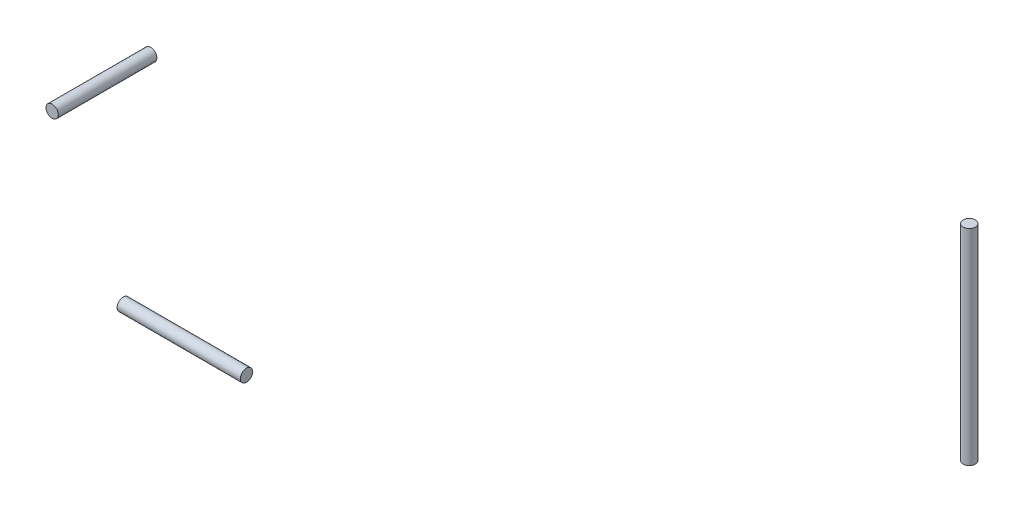
ISO-10303-21;
HEADER;
FILE_DESCRIPTION(('STEP AP214'),'2;1');
FILE_NAME('part.step','',(''),(''),'','','');
FILE_SCHEMA(('AUTOMOTIVE_DESIGN { 1 0 10303 214 1 1 1 1 }'));
ENDSEC;
DATA;
#1=APPLICATION_CONTEXT('core data for automotive mechanical design processes');
#2=APPLICATION_PROTOCOL_DEFINITION('international standard','automotive_design',2000,#1);
#3=PRODUCT_CONTEXT('',#1,'mechanical');
#4=PRODUCT('Part','Part','',(#3));
#5=PRODUCT_RELATED_PRODUCT_CATEGORY('part','',(#4));
#6=PRODUCT_DEFINITION_FORMATION('','',#4);
#7=PRODUCT_DEFINITION_CONTEXT('part definition',#1,'design');
#8=PRODUCT_DEFINITION('design','',#6,#7);
#9=PRODUCT_DEFINITION_SHAPE('','',#8);
#10=(LENGTH_UNIT() NAMED_UNIT(*) SI_UNIT(.MILLI.,.METRE.));
#11=(NAMED_UNIT(*) PLANE_ANGLE_UNIT() SI_UNIT($,.RADIAN.));
#12=(NAMED_UNIT(*) SI_UNIT($,.STERADIAN.) SOLID_ANGLE_UNIT());
#13=UNCERTAINTY_MEASURE_WITH_UNIT(LENGTH_MEASURE(1.E-05),#10,'distance_accuracy_value','');
#14=(GEOMETRIC_REPRESENTATION_CONTEXT(3) GLOBAL_UNCERTAINTY_ASSIGNED_CONTEXT((#13)) GLOBAL_UNIT_ASSIGNED_CONTEXT((#10,
#11,#12)) REPRESENTATION_CONTEXT('',''));
#15=CARTESIAN_POINT('',(0.,0.,0.));
#16=DIRECTION('',(0.,0.,1.));
#17=DIRECTION('',(1.,0.,0.));
#18=AXIS2_PLACEMENT_3D('',#15,#16,#17);
#19=CARTESIAN_POINT('',(104.,219.,64.));
#20=DIRECTION('',(-1.,0.,0.));
#21=DIRECTION('',(0.,0.,1.));
#22=AXIS2_PLACEMENT_3D('',#19,#20,#21);
#23=CYLINDRICAL_SURFACE('',#22,0.750000000000001);
#24=CARTESIAN_POINT('',(104.,219.,64.));
#25=DIRECTION('',(1.,0.,0.));
#26=DIRECTION('',(0.,0.,-1.));
#27=AXIS2_PLACEMENT_3D('',#24,#25,#26);
#28=CIRCLE('',#27,0.750000000000001);
#29=CARTESIAN_POINT('',(104.,219.,63.25));
#30=VERTEX_POINT('',#29);
#31=EDGE_CURVE('E11',#30,#30,#28,.T.);
#32=ORIENTED_EDGE('',*,*,#31,.F.);
#33=EDGE_LOOP('',(#32));
#34=FACE_BOUND('',#33,.T.);
#35=CARTESIAN_POINT('',(89.,219.,64.));
#36=DIRECTION('',(1.,0.,0.));
#37=DIRECTION('',(0.,0.,-1.));
#38=AXIS2_PLACEMENT_3D('',#35,#36,#37);
#39=CIRCLE('',#38,0.750000000000001);
#40=CARTESIAN_POINT('',(89.,219.,63.25));
#41=VERTEX_POINT('',#40);
#42=EDGE_CURVE('E49',#41,#41,#39,.T.);
#43=ORIENTED_EDGE('',*,*,#42,.T.);
#44=EDGE_LOOP('',(#43));
#45=FACE_BOUND('',#44,.T.);
#46=ADVANCED_FACE('F46',(#34,#45),#23,.T.);
#47=CARTESIAN_POINT('',(104.,219.,64.));
#48=DIRECTION('',(1.,0.,0.));
#49=DIRECTION('',(0.,0.,-1.));
#50=AXIS2_PLACEMENT_3D('',#47,#48,#49);
#51=PLANE('',#50);
#52=ORIENTED_EDGE('',*,*,#31,.T.);
#53=EDGE_LOOP('',(#52));
#54=FACE_BOUND('',#53,.T.);
#55=ADVANCED_FACE('F61',(#54),#51,.T.);
#56=CARTESIAN_POINT('',(89.,219.,64.));
#57=DIRECTION('',(1.,0.,0.));
#58=DIRECTION('',(0.,0.,-1.));
#59=AXIS2_PLACEMENT_3D('',#56,#57,#58);
#60=PLANE('',#59);
#61=ORIENTED_EDGE('',*,*,#42,.F.);
#62=EDGE_LOOP('',(#61));
#63=FACE_BOUND('',#62,.T.);
#64=ADVANCED_FACE('F59',(#63),#60,.F.);
#65=CLOSED_SHELL('',(#46,#55,#64));
#66=MANIFOLD_SOLID_BREP('B2',#65);
#67=CARTESIAN_POINT('',(128.,215.,0.));
#68=DIRECTION('',(0.,-1.,0.));
#69=DIRECTION('',(0.,0.,-1.));
#70=AXIS2_PLACEMENT_3D('',#67,#68,#69);
#71=CYLINDRICAL_SURFACE('',#70,0.750000000000001);
#72=CARTESIAN_POINT('',(128.,215.,0.));
#73=DIRECTION('',(0.,1.,0.));
#74=DIRECTION('',(0.,0.,1.));
#75=AXIS2_PLACEMENT_3D('',#72,#73,#74);
#76=CIRCLE('',#75,0.750000000000001);
#77=CARTESIAN_POINT('',(128.,215.,0.750000000000001));
#78=VERTEX_POINT('',#77);
#79=EDGE_CURVE('E45',#78,#78,#76,.T.);
#80=ORIENTED_EDGE('',*,*,#79,.F.);
#81=EDGE_LOOP('',(#80));
#82=FACE_BOUND('',#81,.T.);
#83=CARTESIAN_POINT('',(128.,190.,0.));
#84=DIRECTION('',(0.,1.,0.));
#85=DIRECTION('',(0.,0.,1.));
#86=AXIS2_PLACEMENT_3D('',#83,#84,#85);
#87=CIRCLE('',#86,0.750000000000001);
#88=CARTESIAN_POINT('',(128.,190.,0.750000000000001));
#89=VERTEX_POINT('',#88);
#90=EDGE_CURVE('E97',#89,#89,#87,.T.);
#91=ORIENTED_EDGE('',*,*,#90,.T.);
#92=EDGE_LOOP('',(#91));
#93=FACE_BOUND('',#92,.T.);
#94=ADVANCED_FACE('F94',(#82,#93),#71,.T.);
#95=CARTESIAN_POINT('',(128.,215.,0.));
#96=DIRECTION('',(0.,1.,0.));
#97=DIRECTION('',(0.,0.,1.));
#98=AXIS2_PLACEMENT_3D('',#95,#96,#97);
#99=PLANE('',#98);
#100=ORIENTED_EDGE('',*,*,#79,.T.);
#101=EDGE_LOOP('',(#100));
#102=FACE_BOUND('',#101,.T.);
#103=ADVANCED_FACE('F109',(#102),#99,.T.);
#104=CARTESIAN_POINT('',(128.,190.,0.));
#105=DIRECTION('',(0.,1.,0.));
#106=DIRECTION('',(0.,0.,1.));
#107=AXIS2_PLACEMENT_3D('',#104,#105,#106);
#108=PLANE('',#107);
#109=ORIENTED_EDGE('',*,*,#90,.F.);
#110=EDGE_LOOP('',(#109));
#111=FACE_BOUND('',#110,.T.);
#112=ADVANCED_FACE('F107',(#111),#108,.F.);
#113=CLOSED_SHELL('',(#94,#103,#112));
#114=MANIFOLD_SOLID_BREP('B6',#113);
#115=CARTESIAN_POINT('',(66.34,221.,50.));
#116=DIRECTION('',(0.,0.,-1.));
#117=DIRECTION('',(-1.,0.,0.));
#118=AXIS2_PLACEMENT_3D('',#115,#116,#117);
#119=CYLINDRICAL_SURFACE('',#118,0.750000000000001);
#120=CARTESIAN_POINT('',(66.34,221.,50.));
#121=DIRECTION('',(0.,0.,1.));
#122=DIRECTION('',(1.,0.,0.));
#123=AXIS2_PLACEMENT_3D('',#120,#121,#122);
#124=CIRCLE('',#123,0.750000000000001);
#125=CARTESIAN_POINT('',(67.09,221.,50.));
#126=VERTEX_POINT('',#125);
#127=EDGE_CURVE('E93',#126,#126,#124,.T.);
#128=ORIENTED_EDGE('',*,*,#127,.F.);
#129=EDGE_LOOP('',(#128));
#130=FACE_BOUND('',#129,.T.);
#131=CARTESIAN_POINT('',(66.34,221.,38.));
#132=DIRECTION('',(0.,0.,1.));
#133=DIRECTION('',(1.,0.,0.));
#134=AXIS2_PLACEMENT_3D('',#131,#132,#133);
#135=CIRCLE('',#134,0.750000000000001);
#136=CARTESIAN_POINT('',(67.09,221.,38.));
#137=VERTEX_POINT('',#136);
#138=EDGE_CURVE('E138',#137,#137,#135,.T.);
#139=ORIENTED_EDGE('',*,*,#138,.T.);
#140=EDGE_LOOP('',(#139));
#141=FACE_BOUND('',#140,.T.);
#142=ADVANCED_FACE('F135',(#130,#141),#119,.T.);
#143=CARTESIAN_POINT('',(66.34,221.,50.));
#144=DIRECTION('',(0.,0.,1.));
#145=DIRECTION('',(1.,0.,0.));
#146=AXIS2_PLACEMENT_3D('',#143,#144,#145);
#147=PLANE('',#146);
#148=ORIENTED_EDGE('',*,*,#127,.T.);
#149=EDGE_LOOP('',(#148));
#150=FACE_BOUND('',#149,.T.);
#151=ADVANCED_FACE('F150',(#150),#147,.T.);
#152=CARTESIAN_POINT('',(66.34,221.,38.));
#153=DIRECTION('',(0.,0.,1.));
#154=DIRECTION('',(1.,0.,0.));
#155=AXIS2_PLACEMENT_3D('',#152,#153,#154);
#156=PLANE('',#155);
#157=ORIENTED_EDGE('',*,*,#138,.F.);
#158=EDGE_LOOP('',(#157));
#159=FACE_BOUND('',#158,.T.);
#160=ADVANCED_FACE('F148',(#159),#156,.F.);
#161=CLOSED_SHELL('',(#142,#151,#160));
#162=MANIFOLD_SOLID_BREP('B40',#161);
#163=ADVANCED_BREP_SHAPE_REPRESENTATION('',(#18,#66,#114,#162),#14);
#164=SHAPE_DEFINITION_REPRESENTATION(#9,#163);
ENDSEC;
END-ISO-10303-21;
